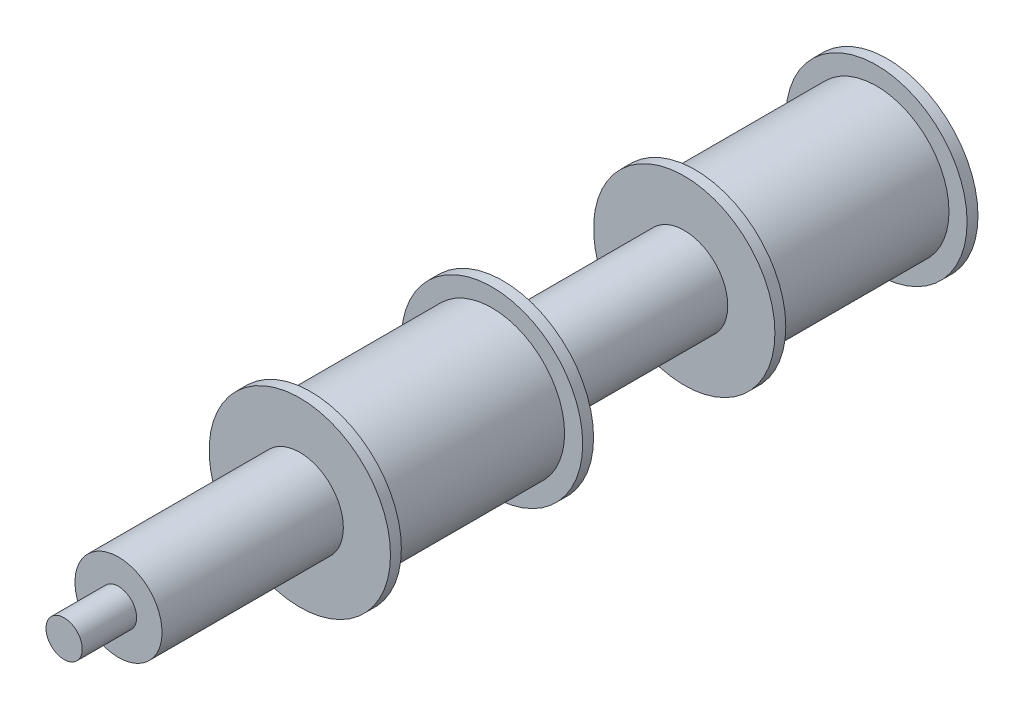
ISO-10303-21;
HEADER;
FILE_DESCRIPTION(('STEP AP214'),'2;1');
FILE_NAME('part.step','',(''),(''),'','','');
FILE_SCHEMA(('AUTOMOTIVE_DESIGN { 1 0 10303 214 1 1 1 1 }'));
ENDSEC;
DATA;
#1=APPLICATION_CONTEXT('core data for automotive mechanical design processes');
#2=APPLICATION_PROTOCOL_DEFINITION('international standard','automotive_design',2000,#1);
#3=PRODUCT_CONTEXT('',#1,'mechanical');
#4=PRODUCT('Part','Part','',(#3));
#5=PRODUCT_RELATED_PRODUCT_CATEGORY('part','',(#4));
#6=PRODUCT_DEFINITION_FORMATION('','',#4);
#7=PRODUCT_DEFINITION_CONTEXT('part definition',#1,'design');
#8=PRODUCT_DEFINITION('design','',#6,#7);
#9=PRODUCT_DEFINITION_SHAPE('','',#8);
#10=(LENGTH_UNIT() NAMED_UNIT(*) SI_UNIT(.MILLI.,.METRE.));
#11=(NAMED_UNIT(*) PLANE_ANGLE_UNIT() SI_UNIT($,.RADIAN.));
#12=(NAMED_UNIT(*) SI_UNIT($,.STERADIAN.) SOLID_ANGLE_UNIT());
#13=UNCERTAINTY_MEASURE_WITH_UNIT(LENGTH_MEASURE(1.E-05),#10,'distance_accuracy_value','');
#14=(GEOMETRIC_REPRESENTATION_CONTEXT(3) GLOBAL_UNCERTAINTY_ASSIGNED_CONTEXT((#13)) GLOBAL_UNIT_ASSIGNED_CONTEXT((#10,
#11,#12)) REPRESENTATION_CONTEXT('',''));
#15=CARTESIAN_POINT('',(0.,0.,0.));
#16=DIRECTION('',(0.,0.,1.));
#17=DIRECTION('',(1.,0.,0.));
#18=AXIS2_PLACEMENT_3D('',#15,#16,#17);
#19=CARTESIAN_POINT('',(0.,0.,3.));
#20=DIRECTION('',(0.,0.,-1.));
#21=DIRECTION('',(-1.,0.,0.));
#22=AXIS2_PLACEMENT_3D('',#19,#20,#21);
#23=CYLINDRICAL_SURFACE('',#22,25.);
#24=CARTESIAN_POINT('',(0.,0.,3.));
#25=DIRECTION('',(0.,0.,1.));
#26=DIRECTION('',(1.,0.,0.));
#27=AXIS2_PLACEMENT_3D('',#24,#25,#26);
#28=CIRCLE('',#27,25.);
#29=CARTESIAN_POINT('',(25.,0.,3.));
#30=VERTEX_POINT('',#29);
#31=EDGE_CURVE('E87',#30,#30,#28,.T.);
#32=ORIENTED_EDGE('',*,*,#31,.F.);
#33=EDGE_LOOP('',(#32));
#34=FACE_BOUND('',#33,.T.);
#35=CARTESIAN_POINT('',(0.,0.,0.));
#36=DIRECTION('',(0.,0.,1.));
#37=DIRECTION('',(1.,0.,0.));
#38=AXIS2_PLACEMENT_3D('',#35,#36,#37);
#39=CIRCLE('',#38,25.);
#40=CARTESIAN_POINT('',(25.,0.,0.));
#41=VERTEX_POINT('',#40);
#42=EDGE_CURVE('E36',#41,#41,#39,.T.);
#43=ORIENTED_EDGE('',*,*,#42,.T.);
#44=EDGE_LOOP('',(#43));
#45=FACE_BOUND('',#44,.T.);
#46=ADVANCED_FACE('F33',(#34,#45),#23,.T.);
#47=CARTESIAN_POINT('',(0.,0.,3.));
#48=DIRECTION('',(0.,0.,1.));
#49=DIRECTION('',(1.,0.,0.));
#50=AXIS2_PLACEMENT_3D('',#47,#48,#49);
#51=PLANE('',#50);
#52=CARTESIAN_POINT('',(0.,0.,3.));
#53=DIRECTION('',(0.,0.,1.));
#54=DIRECTION('',(1.,0.,0.));
#55=AXIS2_PLACEMENT_3D('',#52,#53,#54);
#56=CIRCLE('',#55,20.);
#57=CARTESIAN_POINT('',(20.,0.,3.));
#58=VERTEX_POINT('',#57);
#59=EDGE_CURVE('E77',#58,#58,#56,.T.);
#60=ORIENTED_EDGE('',*,*,#59,.F.);
#61=EDGE_LOOP('',(#60));
#62=FACE_BOUND('',#61,.T.);
#63=ORIENTED_EDGE('',*,*,#31,.T.);
#64=EDGE_LOOP('',(#63));
#65=FACE_BOUND('',#64,.T.);
#66=ADVANCED_FACE('F98',(#62,#65),#51,.T.);
#67=CARTESIAN_POINT('',(0.,0.,0.));
#68=DIRECTION('',(0.,0.,1.));
#69=DIRECTION('',(1.,0.,0.));
#70=AXIS2_PLACEMENT_3D('',#67,#68,#69);
#71=PLANE('',#70);
#72=ORIENTED_EDGE('',*,*,#42,.F.);
#73=EDGE_LOOP('',(#72));
#74=FACE_BOUND('',#73,.T.);
#75=ADVANCED_FACE('F95',(#74),#71,.F.);
#76=CARTESIAN_POINT('',(0.,0.,53.));
#77=DIRECTION('',(0.,0.,-1.));
#78=DIRECTION('',(-1.,0.,0.));
#79=AXIS2_PLACEMENT_3D('',#76,#77,#78);
#80=CYLINDRICAL_SURFACE('',#79,20.);
#81=CARTESIAN_POINT('',(0.,0.,53.));
#82=DIRECTION('',(0.,0.,1.));
#83=DIRECTION('',(1.,0.,0.));
#84=AXIS2_PLACEMENT_3D('',#81,#82,#83);
#85=CIRCLE('',#84,20.);
#86=CARTESIAN_POINT('',(20.,0.,53.));
#87=VERTEX_POINT('',#86);
#88=EDGE_CURVE('E81',#87,#87,#85,.T.);
#89=ORIENTED_EDGE('',*,*,#88,.F.);
#90=EDGE_LOOP('',(#89));
#91=FACE_BOUND('',#90,.T.);
#92=ORIENTED_EDGE('',*,*,#59,.T.);
#93=EDGE_LOOP('',(#92));
#94=FACE_BOUND('',#93,.T.);
#95=ADVANCED_FACE('F97',(#91,#94),#80,.T.);
#96=CARTESIAN_POINT('',(0.,0.,56.));
#97=DIRECTION('',(0.,0.,-1.));
#98=DIRECTION('',(-1.,0.,0.));
#99=AXIS2_PLACEMENT_3D('',#96,#97,#98);
#100=CYLINDRICAL_SURFACE('',#99,25.);
#101=CARTESIAN_POINT('',(0.,0.,56.));
#102=DIRECTION('',(0.,0.,1.));
#103=DIRECTION('',(1.,0.,0.));
#104=AXIS2_PLACEMENT_3D('',#101,#102,#103);
#105=CIRCLE('',#104,25.);
#106=CARTESIAN_POINT('',(25.,0.,56.));
#107=VERTEX_POINT('',#106);
#108=EDGE_CURVE('E78',#107,#107,#105,.T.);
#109=ORIENTED_EDGE('',*,*,#108,.F.);
#110=EDGE_LOOP('',(#109));
#111=FACE_BOUND('',#110,.T.);
#112=CARTESIAN_POINT('',(0.,0.,53.));
#113=DIRECTION('',(0.,0.,1.));
#114=DIRECTION('',(1.,0.,0.));
#115=AXIS2_PLACEMENT_3D('',#112,#113,#114);
#116=CIRCLE('',#115,25.);
#117=CARTESIAN_POINT('',(25.,0.,53.));
#118=VERTEX_POINT('',#117);
#119=EDGE_CURVE('E74',#118,#118,#116,.T.);
#120=ORIENTED_EDGE('',*,*,#119,.T.);
#121=EDGE_LOOP('',(#120));
#122=FACE_BOUND('',#121,.T.);
#123=ADVANCED_FACE('F103',(#111,#122),#100,.T.);
#124=CARTESIAN_POINT('',(0.,0.,56.));
#125=DIRECTION('',(0.,0.,1.));
#126=DIRECTION('',(1.,0.,0.));
#127=AXIS2_PLACEMENT_3D('',#124,#125,#126);
#128=PLANE('',#127);
#129=CARTESIAN_POINT('',(0.,0.,56.));
#130=DIRECTION('',(0.,0.,1.));
#131=DIRECTION('',(1.,0.,0.));
#132=AXIS2_PLACEMENT_3D('',#129,#130,#131);
#133=CIRCLE('',#132,12.);
#134=CARTESIAN_POINT('',(12.,0.,56.));
#135=VERTEX_POINT('',#134);
#136=EDGE_CURVE('E65',#135,#135,#133,.T.);
#137=ORIENTED_EDGE('',*,*,#136,.F.);
#138=EDGE_LOOP('',(#137));
#139=FACE_BOUND('',#138,.T.);
#140=ORIENTED_EDGE('',*,*,#108,.T.);
#141=EDGE_LOOP('',(#140));
#142=FACE_BOUND('',#141,.T.);
#143=ADVANCED_FACE('F133',(#139,#142),#128,.T.);
#144=CARTESIAN_POINT('',(0.,0.,53.));
#145=DIRECTION('',(0.,0.,1.));
#146=DIRECTION('',(1.,0.,0.));
#147=AXIS2_PLACEMENT_3D('',#144,#145,#146);
#148=PLANE('',#147);
#149=ORIENTED_EDGE('',*,*,#88,.T.);
#150=EDGE_LOOP('',(#149));
#151=FACE_BOUND('',#150,.T.);
#152=ORIENTED_EDGE('',*,*,#119,.F.);
#153=EDGE_LOOP('',(#152));
#154=FACE_BOUND('',#153,.T.);
#155=ADVANCED_FACE('F141',(#151,#154),#148,.F.);
#156=CARTESIAN_POINT('',(0.,0.,106.));
#157=DIRECTION('',(0.,0.,-1.));
#158=DIRECTION('',(-1.,0.,0.));
#159=AXIS2_PLACEMENT_3D('',#156,#157,#158);
#160=CYLINDRICAL_SURFACE('',#159,12.);
#161=CARTESIAN_POINT('',(0.,0.,106.));
#162=DIRECTION('',(0.,0.,1.));
#163=DIRECTION('',(1.,0.,0.));
#164=AXIS2_PLACEMENT_3D('',#161,#162,#163);
#165=CIRCLE('',#164,12.);
#166=CARTESIAN_POINT('',(12.,0.,106.));
#167=VERTEX_POINT('',#166);
#168=EDGE_CURVE('E69',#167,#167,#165,.T.);
#169=ORIENTED_EDGE('',*,*,#168,.F.);
#170=EDGE_LOOP('',(#169));
#171=FACE_BOUND('',#170,.T.);
#172=ORIENTED_EDGE('',*,*,#136,.T.);
#173=EDGE_LOOP('',(#172));
#174=FACE_BOUND('',#173,.T.);
#175=ADVANCED_FACE('F146',(#171,#174),#160,.T.);
#176=CARTESIAN_POINT('',(0.,0.,109.));
#177=DIRECTION('',(0.,0.,-1.));
#178=DIRECTION('',(-1.,0.,0.));
#179=AXIS2_PLACEMENT_3D('',#176,#177,#178);
#180=CYLINDRICAL_SURFACE('',#179,25.);
#181=CARTESIAN_POINT('',(0.,0.,109.));
#182=DIRECTION('',(0.,0.,1.));
#183=DIRECTION('',(1.,0.,0.));
#184=AXIS2_PLACEMENT_3D('',#181,#182,#183);
#185=CIRCLE('',#184,25.);
#186=CARTESIAN_POINT('',(25.,0.,109.));
#187=VERTEX_POINT('',#186);
#188=EDGE_CURVE('E66',#187,#187,#185,.T.);
#189=ORIENTED_EDGE('',*,*,#188,.F.);
#190=EDGE_LOOP('',(#189));
#191=FACE_BOUND('',#190,.T.);
#192=CARTESIAN_POINT('',(0.,0.,106.));
#193=DIRECTION('',(0.,0.,1.));
#194=DIRECTION('',(1.,0.,0.));
#195=AXIS2_PLACEMENT_3D('',#192,#193,#194);
#196=CIRCLE('',#195,25.);
#197=CARTESIAN_POINT('',(25.,0.,106.));
#198=VERTEX_POINT('',#197);
#199=EDGE_CURVE('E62',#198,#198,#196,.T.);
#200=ORIENTED_EDGE('',*,*,#199,.T.);
#201=EDGE_LOOP('',(#200));
#202=FACE_BOUND('',#201,.T.);
#203=ADVANCED_FACE('F163',(#191,#202),#180,.T.);
#204=CARTESIAN_POINT('',(0.,0.,109.));
#205=DIRECTION('',(0.,0.,1.));
#206=DIRECTION('',(1.,0.,0.));
#207=AXIS2_PLACEMENT_3D('',#204,#205,#206);
#208=PLANE('',#207);
#209=CARTESIAN_POINT('',(0.,0.,109.));
#210=DIRECTION('',(0.,0.,1.));
#211=DIRECTION('',(1.,0.,0.));
#212=AXIS2_PLACEMENT_3D('',#209,#210,#211);
#213=CIRCLE('',#212,20.);
#214=CARTESIAN_POINT('',(20.,0.,109.));
#215=VERTEX_POINT('',#214);
#216=EDGE_CURVE('E45',#215,#215,#213,.T.);
#217=ORIENTED_EDGE('',*,*,#216,.F.);
#218=EDGE_LOOP('',(#217));
#219=FACE_BOUND('',#218,.T.);
#220=ORIENTED_EDGE('',*,*,#188,.T.);
#221=EDGE_LOOP('',(#220));
#222=FACE_BOUND('',#221,.T.);
#223=ADVANCED_FACE('F173',(#219,#222),#208,.T.);
#224=CARTESIAN_POINT('',(0.,0.,106.));
#225=DIRECTION('',(0.,0.,1.));
#226=DIRECTION('',(1.,0.,0.));
#227=AXIS2_PLACEMENT_3D('',#224,#225,#226);
#228=PLANE('',#227);
#229=ORIENTED_EDGE('',*,*,#168,.T.);
#230=EDGE_LOOP('',(#229));
#231=FACE_BOUND('',#230,.T.);
#232=ORIENTED_EDGE('',*,*,#199,.F.);
#233=EDGE_LOOP('',(#232));
#234=FACE_BOUND('',#233,.T.);
#235=ADVANCED_FACE('F181',(#231,#234),#228,.F.);
#236=CARTESIAN_POINT('',(0.,0.,159.));
#237=DIRECTION('',(0.,0.,-1.));
#238=DIRECTION('',(-1.,0.,0.));
#239=AXIS2_PLACEMENT_3D('',#236,#237,#238);
#240=CYLINDRICAL_SURFACE('',#239,20.);
#241=CARTESIAN_POINT('',(0.,0.,159.));
#242=DIRECTION('',(0.,0.,1.));
#243=DIRECTION('',(1.,0.,0.));
#244=AXIS2_PLACEMENT_3D('',#241,#242,#243);
#245=CIRCLE('',#244,20.);
#246=CARTESIAN_POINT('',(20.,0.,159.));
#247=VERTEX_POINT('',#246);
#248=EDGE_CURVE('E57',#247,#247,#245,.T.);
#249=ORIENTED_EDGE('',*,*,#248,.F.);
#250=EDGE_LOOP('',(#249));
#251=FACE_BOUND('',#250,.T.);
#252=ORIENTED_EDGE('',*,*,#216,.T.);
#253=EDGE_LOOP('',(#252));
#254=FACE_BOUND('',#253,.T.);
#255=ADVANCED_FACE('F186',(#251,#254),#240,.T.);
#256=CARTESIAN_POINT('',(0.,0.,162.));
#257=DIRECTION('',(0.,0.,-1.));
#258=DIRECTION('',(-1.,0.,0.));
#259=AXIS2_PLACEMENT_3D('',#256,#257,#258);
#260=CYLINDRICAL_SURFACE('',#259,25.);
#261=CARTESIAN_POINT('',(0.,0.,162.));
#262=DIRECTION('',(0.,0.,1.));
#263=DIRECTION('',(1.,0.,0.));
#264=AXIS2_PLACEMENT_3D('',#261,#262,#263);
#265=CIRCLE('',#264,25.);
#266=CARTESIAN_POINT('',(25.,0.,162.));
#267=VERTEX_POINT('',#266);
#268=EDGE_CURVE('E54',#267,#267,#265,.T.);
#269=ORIENTED_EDGE('',*,*,#268,.F.);
#270=EDGE_LOOP('',(#269));
#271=FACE_BOUND('',#270,.T.);
#272=CARTESIAN_POINT('',(0.,0.,159.));
#273=DIRECTION('',(0.,0.,1.));
#274=DIRECTION('',(1.,0.,0.));
#275=AXIS2_PLACEMENT_3D('',#272,#273,#274);
#276=CIRCLE('',#275,25.);
#277=CARTESIAN_POINT('',(25.,0.,159.));
#278=VERTEX_POINT('',#277);
#279=EDGE_CURVE('E52',#278,#278,#276,.T.);
#280=ORIENTED_EDGE('',*,*,#279,.T.);
#281=EDGE_LOOP('',(#280));
#282=FACE_BOUND('',#281,.T.);
#283=ADVANCED_FACE('F203',(#271,#282),#260,.T.);
#284=CARTESIAN_POINT('',(0.,0.,162.));
#285=DIRECTION('',(0.,0.,1.));
#286=DIRECTION('',(1.,0.,0.));
#287=AXIS2_PLACEMENT_3D('',#284,#285,#286);
#288=PLANE('',#287);
#289=CARTESIAN_POINT('',(0.,0.,162.));
#290=DIRECTION('',(0.,0.,1.));
#291=DIRECTION('',(1.,0.,0.));
#292=AXIS2_PLACEMENT_3D('',#289,#290,#291);
#293=CIRCLE('',#292,12.);
#294=CARTESIAN_POINT('',(12.,0.,162.));
#295=VERTEX_POINT('',#294);
#296=EDGE_CURVE('E40',#295,#295,#293,.T.);
#297=ORIENTED_EDGE('',*,*,#296,.F.);
#298=EDGE_LOOP('',(#297));
#299=FACE_BOUND('',#298,.T.);
#300=ORIENTED_EDGE('',*,*,#268,.T.);
#301=EDGE_LOOP('',(#300));
#302=FACE_BOUND('',#301,.T.);
#303=ADVANCED_FACE('F213',(#299,#302),#288,.T.);
#304=CARTESIAN_POINT('',(0.,0.,159.));
#305=DIRECTION('',(0.,0.,1.));
#306=DIRECTION('',(1.,0.,0.));
#307=AXIS2_PLACEMENT_3D('',#304,#305,#306);
#308=PLANE('',#307);
#309=ORIENTED_EDGE('',*,*,#248,.T.);
#310=EDGE_LOOP('',(#309));
#311=FACE_BOUND('',#310,.T.);
#312=ORIENTED_EDGE('',*,*,#279,.F.);
#313=EDGE_LOOP('',(#312));
#314=FACE_BOUND('',#313,.T.);
#315=ADVANCED_FACE('F221',(#311,#314),#308,.F.);
#316=CARTESIAN_POINT('',(0.,0.,212.));
#317=DIRECTION('',(0.,0.,-1.));
#318=DIRECTION('',(-1.,0.,0.));
#319=AXIS2_PLACEMENT_3D('',#316,#317,#318);
#320=CYLINDRICAL_SURFACE('',#319,12.);
#321=CARTESIAN_POINT('',(0.,0.,212.));
#322=DIRECTION('',(0.,0.,1.));
#323=DIRECTION('',(1.,0.,0.));
#324=AXIS2_PLACEMENT_3D('',#321,#322,#323);
#325=CIRCLE('',#324,12.);
#326=CARTESIAN_POINT('',(12.,0.,212.));
#327=VERTEX_POINT('',#326);
#328=EDGE_CURVE('E50',#327,#327,#325,.T.);
#329=ORIENTED_EDGE('',*,*,#328,.F.);
#330=EDGE_LOOP('',(#329));
#331=FACE_BOUND('',#330,.T.);
#332=ORIENTED_EDGE('',*,*,#296,.T.);
#333=EDGE_LOOP('',(#332));
#334=FACE_BOUND('',#333,.T.);
#335=ADVANCED_FACE('F226',(#331,#334),#320,.T.);
#336=CARTESIAN_POINT('',(0.,0.,212.));
#337=DIRECTION('',(0.,0.,1.));
#338=DIRECTION('',(1.,0.,0.));
#339=AXIS2_PLACEMENT_3D('',#336,#337,#338);
#340=PLANE('',#339);
#341=CARTESIAN_POINT('',(0.,0.,212.));
#342=DIRECTION('',(0.,0.,1.));
#343=DIRECTION('',(1.,0.,0.));
#344=AXIS2_PLACEMENT_3D('',#341,#342,#343);
#345=CIRCLE('',#344,5.);
#346=CARTESIAN_POINT('',(5.,0.,212.));
#347=VERTEX_POINT('',#346);
#348=EDGE_CURVE('E10',#347,#347,#345,.T.);
#349=ORIENTED_EDGE('',*,*,#348,.F.);
#350=EDGE_LOOP('',(#349));
#351=FACE_BOUND('',#350,.T.);
#352=ORIENTED_EDGE('',*,*,#328,.T.);
#353=EDGE_LOOP('',(#352));
#354=FACE_BOUND('',#353,.T.);
#355=ADVANCED_FACE('F243',(#351,#354),#340,.T.);
#356=CARTESIAN_POINT('',(0.,0.,227.));
#357=DIRECTION('',(0.,0.,-1.));
#358=DIRECTION('',(-1.,0.,0.));
#359=AXIS2_PLACEMENT_3D('',#356,#357,#358);
#360=CYLINDRICAL_SURFACE('',#359,5.);
#361=CARTESIAN_POINT('',(0.,0.,227.));
#362=DIRECTION('',(0.,0.,1.));
#363=DIRECTION('',(1.,0.,0.));
#364=AXIS2_PLACEMENT_3D('',#361,#362,#363);
#365=CIRCLE('',#364,5.);
#366=CARTESIAN_POINT('',(5.,0.,227.));
#367=VERTEX_POINT('',#366);
#368=EDGE_CURVE('E49',#367,#367,#365,.T.);
#369=ORIENTED_EDGE('',*,*,#368,.F.);
#370=EDGE_LOOP('',(#369));
#371=FACE_BOUND('',#370,.T.);
#372=ORIENTED_EDGE('',*,*,#348,.T.);
#373=EDGE_LOOP('',(#372));
#374=FACE_BOUND('',#373,.T.);
#375=ADVANCED_FACE('F253',(#371,#374),#360,.T.);
#376=CARTESIAN_POINT('',(0.,0.,227.));
#377=DIRECTION('',(0.,0.,1.));
#378=DIRECTION('',(1.,0.,0.));
#379=AXIS2_PLACEMENT_3D('',#376,#377,#378);
#380=PLANE('',#379);
#381=ORIENTED_EDGE('',*,*,#368,.T.);
#382=EDGE_LOOP('',(#381));
#383=FACE_BOUND('',#382,.T.);
#384=ADVANCED_FACE('F263',(#383),#380,.T.);
#385=CLOSED_SHELL('',(#46,#66,#75,#95,#123,#143,#155,#175,#203,#223,#235,#255,#283,#303,#315,
#335,#355,#375,#384));
#386=MANIFOLD_SOLID_BREP('B2',#385);
#387=ADVANCED_BREP_SHAPE_REPRESENTATION('',(#18,#386),#14);
#388=SHAPE_DEFINITION_REPRESENTATION(#9,#387);
ENDSEC;
END-ISO-10303-21;
